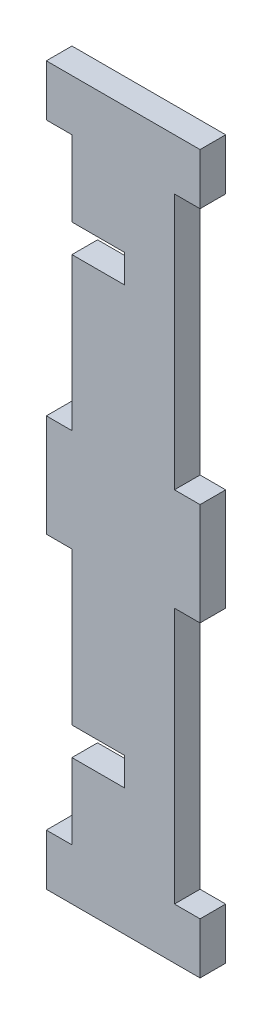
ISO-10303-21;
HEADER;
FILE_DESCRIPTION(('STEP AP214'),'2;1');
FILE_NAME('part.step','',(''),(''),'','','');
FILE_SCHEMA(('AUTOMOTIVE_DESIGN { 1 0 10303 214 1 1 1 1 }'));
ENDSEC;
DATA;
#1=APPLICATION_CONTEXT('core data for automotive mechanical design processes');
#2=APPLICATION_PROTOCOL_DEFINITION('international standard','automotive_design',2000,#1);
#3=PRODUCT_CONTEXT('',#1,'mechanical');
#4=PRODUCT('Part','Part','',(#3));
#5=PRODUCT_RELATED_PRODUCT_CATEGORY('part','',(#4));
#6=PRODUCT_DEFINITION_FORMATION('','',#4);
#7=PRODUCT_DEFINITION_CONTEXT('part definition',#1,'design');
#8=PRODUCT_DEFINITION('design','',#6,#7);
#9=PRODUCT_DEFINITION_SHAPE('','',#8);
#10=(LENGTH_UNIT() NAMED_UNIT(*) SI_UNIT(.MILLI.,.METRE.));
#11=(NAMED_UNIT(*) PLANE_ANGLE_UNIT() SI_UNIT($,.RADIAN.));
#12=(NAMED_UNIT(*) SI_UNIT($,.STERADIAN.) SOLID_ANGLE_UNIT());
#13=UNCERTAINTY_MEASURE_WITH_UNIT(LENGTH_MEASURE(1.E-05),#10,'distance_accuracy_value','');
#14=(GEOMETRIC_REPRESENTATION_CONTEXT(3) GLOBAL_UNCERTAINTY_ASSIGNED_CONTEXT((#13)) GLOBAL_UNIT_ASSIGNED_CONTEXT((#10,
#11,#12)) REPRESENTATION_CONTEXT('',''));
#15=CARTESIAN_POINT('',(0.,0.,0.));
#16=DIRECTION('',(0.,0.,1.));
#17=DIRECTION('',(1.,0.,0.));
#18=AXIS2_PLACEMENT_3D('',#15,#16,#17);
#19=CARTESIAN_POINT('',(-1086.45434164187,-202.296998666354,2.5));
#20=DIRECTION('',(-0.999999999999995,-1.02775432608838E-07,0.));
#21=DIRECTION('',(1.02775432608838E-07,-0.999999999999995,0.));
#22=AXIS2_PLACEMENT_3D('',#19,#20,#21);
#23=PLANE('',#22);
#24=DIRECTION('',(-1.02775432608838E-07,0.999999999999995,0.));
#25=VECTOR('',#24,1.);
#26=CARTESIAN_POINT('',(-1086.45434164187,-202.296998666354,-2.5));
#27=LINE('',#26,#25);
#28=CARTESIAN_POINT('',(-1086.45434061412,-212.296998666354,-2.5));
#29=VERTEX_POINT('',#28);
#30=CARTESIAN_POINT('',(-1086.45434164187,-202.296998666354,-2.5));
#31=VERTEX_POINT('',#30);
#32=EDGE_CURVE('E249',#29,#31,#27,.T.);
#33=ORIENTED_EDGE('',*,*,#32,.T.);
#34=DIRECTION('',(0.,0.,-1.));
#35=VECTOR('',#34,1.);
#36=CARTESIAN_POINT('',(-1086.45434164187,-202.296998666354,2.5));
#37=LINE('',#36,#35);
#38=CARTESIAN_POINT('',(-1086.45434164187,-202.296998666354,2.5));
#39=VERTEX_POINT('',#38);
#40=EDGE_CURVE('E11',#39,#31,#37,.T.);
#41=ORIENTED_EDGE('',*,*,#40,.F.);
#42=DIRECTION('',(-1.02775432608838E-07,0.999999999999995,0.));
#43=VECTOR('',#42,1.);
#44=CARTESIAN_POINT('',(-1086.45434164187,-202.296998666354,2.5));
#45=LINE('',#44,#43);
#46=CARTESIAN_POINT('',(-1086.45434061412,-212.296998666354,2.5));
#47=VERTEX_POINT('',#46);
#48=EDGE_CURVE('E303',#47,#39,#45,.T.);
#49=ORIENTED_EDGE('',*,*,#48,.F.);
#50=DIRECTION('',(0.,0.,-1.));
#51=VECTOR('',#50,1.);
#52=CARTESIAN_POINT('',(-1086.45434061412,-212.296998666354,2.5));
#53=LINE('',#52,#51);
#54=EDGE_CURVE('E245',#47,#29,#53,.T.);
#55=ORIENTED_EDGE('',*,*,#54,.T.);
#56=EDGE_LOOP('',(#33,#41,#49,#55));
#57=FACE_BOUND('',#56,.T.);
#58=ADVANCED_FACE('F33',(#57),#23,.F.);
#59=CARTESIAN_POINT('',(-1091.45434164187,-202.296999180231,2.5));
#60=DIRECTION('',(1.02775432608834E-07,-0.999999999999995,0.));
#61=DIRECTION('',(0.999999999999995,1.02775432608834E-07,0.));
#62=AXIS2_PLACEMENT_3D('',#59,#60,#61);
#63=PLANE('',#62);
#64=DIRECTION('',(-0.999999999999995,-1.02775432608834E-07,0.));
#65=VECTOR('',#64,1.);
#66=CARTESIAN_POINT('',(-1091.45434164187,-202.296999180231,-2.5));
#67=LINE('',#66,#65);
#68=CARTESIAN_POINT('',(-1091.45434164187,-202.296999180231,-2.5));
#69=VERTEX_POINT('',#68);
#70=EDGE_CURVE('E252',#31,#69,#67,.T.);
#71=ORIENTED_EDGE('',*,*,#70,.T.);
#72=DIRECTION('',(0.,0.,-1.));
#73=VECTOR('',#72,1.);
#74=CARTESIAN_POINT('',(-1091.45434164187,-202.296999180231,2.5));
#75=LINE('',#74,#73);
#76=CARTESIAN_POINT('',(-1091.45434164187,-202.296999180231,2.5));
#77=VERTEX_POINT('',#76);
#78=EDGE_CURVE('E41',#77,#69,#75,.T.);
#79=ORIENTED_EDGE('',*,*,#78,.F.);
#80=DIRECTION('',(-0.999999999999995,-1.02775432608834E-07,0.));
#81=VECTOR('',#80,1.);
#82=CARTESIAN_POINT('',(-1091.45434164187,-202.296999180231,2.5));
#83=LINE('',#82,#81);
#84=EDGE_CURVE('E152',#39,#77,#83,.T.);
#85=ORIENTED_EDGE('',*,*,#84,.F.);
#86=ORIENTED_EDGE('',*,*,#40,.T.);
#87=EDGE_LOOP('',(#71,#79,#85,#86));
#88=FACE_BOUND('',#87,.T.);
#89=ADVANCED_FACE('F461',(#88),#63,.F.);
#90=CARTESIAN_POINT('',(-1091.45434678064,-152.296999180231,2.5));
#91=DIRECTION('',(-0.999999999999995,-1.02775437049728E-07,0.));
#92=DIRECTION('',(1.02775437049728E-07,-0.999999999999995,0.));
#93=AXIS2_PLACEMENT_3D('',#90,#91,#92);
#94=PLANE('',#93);
#95=DIRECTION('',(-1.02775437049728E-07,0.999999999999995,0.));
#96=VECTOR('',#95,1.);
#97=CARTESIAN_POINT('',(-1091.45434678064,-152.296999180231,-2.5));
#98=LINE('',#97,#96);
#99=CARTESIAN_POINT('',(-1091.45434678064,-152.296999180231,-2.5));
#100=VERTEX_POINT('',#99);
#101=EDGE_CURVE('E254',#69,#100,#98,.T.);
#102=ORIENTED_EDGE('',*,*,#101,.T.);
#103=DIRECTION('',(0.,0.,-1.));
#104=VECTOR('',#103,1.);
#105=CARTESIAN_POINT('',(-1091.45434678064,-152.296999180231,2.5));
#106=LINE('',#105,#104);
#107=CARTESIAN_POINT('',(-1091.45434678064,-152.296999180231,2.5));
#108=VERTEX_POINT('',#107);
#109=EDGE_CURVE('E370',#108,#100,#106,.T.);
#110=ORIENTED_EDGE('',*,*,#109,.F.);
#111=DIRECTION('',(-1.02775437049728E-07,0.999999999999995,0.));
#112=VECTOR('',#111,1.);
#113=CARTESIAN_POINT('',(-1091.45434678064,-152.296999180231,2.5));
#114=LINE('',#113,#112);
#115=EDGE_CURVE('E378',#77,#108,#114,.T.);
#116=ORIENTED_EDGE('',*,*,#115,.F.);
#117=ORIENTED_EDGE('',*,*,#78,.T.);
#118=EDGE_LOOP('',(#102,#110,#116,#117));
#119=FACE_BOUND('',#118,.T.);
#120=ADVANCED_FACE('F376',(#119),#94,.F.);
#121=CARTESIAN_POINT('',(-1086.45434678064,-152.296998666354,2.5));
#122=DIRECTION('',(-1.02775438159972E-07,0.999999999999995,0.));
#123=DIRECTION('',(-0.999999999999995,-1.02775438159972E-07,0.));
#124=AXIS2_PLACEMENT_3D('',#121,#122,#123);
#125=PLANE('',#124);
#126=DIRECTION('',(0.999999999999995,1.02775438159972E-07,0.));
#127=VECTOR('',#126,1.);
#128=CARTESIAN_POINT('',(-1086.45434678064,-152.296998666354,-2.5));
#129=LINE('',#128,#127);
#130=CARTESIAN_POINT('',(-1086.45434678064,-152.296998666354,-2.5));
#131=VERTEX_POINT('',#130);
#132=EDGE_CURVE('E256',#100,#131,#129,.T.);
#133=ORIENTED_EDGE('',*,*,#132,.T.);
#134=DIRECTION('',(0.,0.,-1.));
#135=VECTOR('',#134,1.);
#136=CARTESIAN_POINT('',(-1086.45434678064,-152.296998666354,2.5));
#137=LINE('',#136,#135);
#138=CARTESIAN_POINT('',(-1086.45434678064,-152.296998666354,2.5));
#139=VERTEX_POINT('',#138);
#140=EDGE_CURVE('E367',#139,#131,#137,.T.);
#141=ORIENTED_EDGE('',*,*,#140,.F.);
#142=DIRECTION('',(0.999999999999995,1.02775438159972E-07,0.));
#143=VECTOR('',#142,1.);
#144=CARTESIAN_POINT('',(-1086.45434678064,-152.296998666354,2.5));
#145=LINE('',#144,#143);
#146=EDGE_CURVE('E396',#108,#139,#145,.T.);
#147=ORIENTED_EDGE('',*,*,#146,.F.);
#148=ORIENTED_EDGE('',*,*,#109,.T.);
#149=EDGE_LOOP('',(#133,#141,#147,#148));
#150=FACE_BOUND('',#149,.T.);
#151=ADVANCED_FACE('F387',(#150),#125,.F.);
#152=CARTESIAN_POINT('',(-1086.45434883615,-132.296993578953,2.5));
#153=DIRECTION('',(-0.999999999999995,-1.02775495283673E-07,0.));
#154=DIRECTION('',(1.02775495283673E-07,-0.999999999999995,0.));
#155=AXIS2_PLACEMENT_3D('',#152,#153,#154);
#156=PLANE('',#155);
#157=DIRECTION('',(-1.02775495283673E-07,0.999999999999995,0.));
#158=VECTOR('',#157,1.);
#159=CARTESIAN_POINT('',(-1086.45434883615,-132.296993578953,-2.5));
#160=LINE('',#159,#158);
#161=CARTESIAN_POINT('',(-1086.45434883615,-132.296993578953,-2.5));
#162=VERTEX_POINT('',#161);
#163=EDGE_CURVE('E258',#131,#162,#160,.T.);
#164=ORIENTED_EDGE('',*,*,#163,.T.);
#165=DIRECTION('',(0.,0.,-1.));
#166=VECTOR('',#165,1.);
#167=CARTESIAN_POINT('',(-1086.45434883615,-132.296993578953,2.5));
#168=LINE('',#167,#166);
#169=CARTESIAN_POINT('',(-1086.45434883615,-132.296993578953,2.5));
#170=VERTEX_POINT('',#169);
#171=EDGE_CURVE('E364',#170,#162,#168,.T.);
#172=ORIENTED_EDGE('',*,*,#171,.F.);
#173=DIRECTION('',(-1.02775495283673E-07,0.999999999999995,0.));
#174=VECTOR('',#173,1.);
#175=CARTESIAN_POINT('',(-1086.45434883615,-132.296993578953,2.5));
#176=LINE('',#175,#174);
#177=EDGE_CURVE('E393',#139,#170,#176,.T.);
#178=ORIENTED_EDGE('',*,*,#177,.F.);
#179=ORIENTED_EDGE('',*,*,#140,.T.);
#180=EDGE_LOOP('',(#164,#172,#178,#179));
#181=FACE_BOUND('',#180,.T.);
#182=ADVANCED_FACE('F391',(#181),#156,.F.);
#183=CARTESIAN_POINT('',(-1086.45434883615,-132.296993578953,2.5));
#184=DIRECTION('',(1.02775504773358E-07,-0.999999999999995,0.));
#185=DIRECTION('',(0.999999999999995,1.02775504773358E-07,0.));
#186=AXIS2_PLACEMENT_3D('',#183,#184,#185);
#187=PLANE('',#186);
#188=DIRECTION('',(-0.999999999999995,-1.02775504773358E-07,0.));
#189=VECTOR('',#188,1.);
#190=CARTESIAN_POINT('',(-1086.45434883615,-132.296993578953,-2.5));
#191=LINE('',#190,#189);
#192=CARTESIAN_POINT('',(-1091.45434883615,-132.296994092831,-2.5));
#193=VERTEX_POINT('',#192);
#194=EDGE_CURVE('E260',#162,#193,#191,.T.);
#195=ORIENTED_EDGE('',*,*,#194,.T.);
#196=DIRECTION('',(0.,0.,-1.));
#197=VECTOR('',#196,1.);
#198=CARTESIAN_POINT('',(-1091.45434883615,-132.296994092831,2.5));
#199=LINE('',#198,#197);
#200=CARTESIAN_POINT('',(-1091.45434883615,-132.296994092831,2.5));
#201=VERTEX_POINT('',#200);
#202=EDGE_CURVE('E361',#201,#193,#199,.T.);
#203=ORIENTED_EDGE('',*,*,#202,.F.);
#204=DIRECTION('',(-0.999999999999995,-1.02775504773358E-07,0.));
#205=VECTOR('',#204,1.);
#206=CARTESIAN_POINT('',(-1086.45434883615,-132.296993578953,2.5));
#207=LINE('',#206,#205);
#208=EDGE_CURVE('E395',#170,#201,#207,.T.);
#209=ORIENTED_EDGE('',*,*,#208,.F.);
#210=ORIENTED_EDGE('',*,*,#171,.T.);
#211=EDGE_LOOP('',(#195,#203,#209,#210));
#212=FACE_BOUND('',#211,.T.);
#213=ADVANCED_FACE('F474',(#212),#187,.F.);
#214=CARTESIAN_POINT('',(-1091.45434883615,-132.296994092831,2.5));
#215=DIRECTION('',(-0.999999999999995,-1.0277546369508E-07,0.));
#216=DIRECTION('',(1.0277546369508E-07,-0.999999999999995,0.));
#217=AXIS2_PLACEMENT_3D('',#214,#215,#216);
#218=PLANE('',#217);
#219=DIRECTION('',(-1.0277546369508E-07,0.999999999999995,0.));
#220=VECTOR('',#219,1.);
#221=CARTESIAN_POINT('',(-1091.45434883615,-132.296994092831,-2.5));
#222=LINE('',#221,#220);
#223=CARTESIAN_POINT('',(-1091.45435397492,-82.2969940928305,-2.5));
#224=VERTEX_POINT('',#223);
#225=EDGE_CURVE('E262',#193,#224,#222,.T.);
#226=ORIENTED_EDGE('',*,*,#225,.T.);
#227=DIRECTION('',(0.,0.,-1.));
#228=VECTOR('',#227,1.);
#229=CARTESIAN_POINT('',(-1091.45435397492,-82.2969940928305,2.5));
#230=LINE('',#229,#228);
#231=CARTESIAN_POINT('',(-1091.45435397492,-82.2969940928305,2.5));
#232=VERTEX_POINT('',#231);
#233=EDGE_CURVE('E358',#232,#224,#230,.T.);
#234=ORIENTED_EDGE('',*,*,#233,.F.);
#235=DIRECTION('',(-1.0277546369508E-07,0.999999999999995,0.));
#236=VECTOR('',#235,1.);
#237=CARTESIAN_POINT('',(-1091.45434883615,-132.296994092831,2.5));
#238=LINE('',#237,#236);
#239=EDGE_CURVE('E398',#201,#232,#238,.T.);
#240=ORIENTED_EDGE('',*,*,#239,.F.);
#241=ORIENTED_EDGE('',*,*,#202,.T.);
#242=EDGE_LOOP('',(#226,#234,#240,#241));
#243=FACE_BOUND('',#242,.T.);
#244=ADVANCED_FACE('F477',(#243),#218,.F.);
#245=CARTESIAN_POINT('',(-1091.45435397492,-82.2969940928305,2.5));
#246=DIRECTION('',(-1.02775435384387E-07,0.999999999999995,0.));
#247=DIRECTION('',(-0.999999999999995,-1.02775435384387E-07,0.));
#248=AXIS2_PLACEMENT_3D('',#245,#246,#247);
#249=PLANE('',#248);
#250=DIRECTION('',(0.999999999999995,1.02775435384387E-07,0.));
#251=VECTOR('',#250,1.);
#252=CARTESIAN_POINT('',(-1091.45435397492,-82.2969940928305,-2.5));
#253=LINE('',#252,#251);
#254=CARTESIAN_POINT('',(-1086.45435397492,-82.2969935789533,-2.5));
#255=VERTEX_POINT('',#254);
#256=EDGE_CURVE('E264',#224,#255,#253,.T.);
#257=ORIENTED_EDGE('',*,*,#256,.T.);
#258=DIRECTION('',(0.,0.,-1.));
#259=VECTOR('',#258,1.);
#260=CARTESIAN_POINT('',(-1086.45435397492,-82.2969935789533,2.5));
#261=LINE('',#260,#259);
#262=CARTESIAN_POINT('',(-1086.45435397492,-82.2969935789533,2.5));
#263=VERTEX_POINT('',#262);
#264=EDGE_CURVE('E355',#263,#255,#261,.T.);
#265=ORIENTED_EDGE('',*,*,#264,.F.);
#266=DIRECTION('',(0.999999999999995,1.02775435384387E-07,0.));
#267=VECTOR('',#266,1.);
#268=CARTESIAN_POINT('',(-1091.45435397492,-82.2969940928305,2.5));
#269=LINE('',#268,#267);
#270=EDGE_CURVE('E404',#232,#263,#269,.T.);
#271=ORIENTED_EDGE('',*,*,#270,.F.);
#272=ORIENTED_EDGE('',*,*,#233,.T.);
#273=EDGE_LOOP('',(#257,#265,#271,#272));
#274=FACE_BOUND('',#273,.T.);
#275=ADVANCED_FACE('F481',(#274),#249,.F.);
#276=CARTESIAN_POINT('',(-1086.45435397492,-82.2969935789533,2.5));
#277=DIRECTION('',(-0.999999999999995,-1.02775454813298E-07,0.));
#278=DIRECTION('',(1.02775454813298E-07,-0.999999999999995,0.));
#279=AXIS2_PLACEMENT_3D('',#276,#277,#278);
#280=PLANE('',#279);
#281=DIRECTION('',(-1.02775454813298E-07,0.999999999999995,0.));
#282=VECTOR('',#281,1.);
#283=CARTESIAN_POINT('',(-1086.45435397492,-82.2969935789533,-2.5));
#284=LINE('',#283,#282);
#285=CARTESIAN_POINT('',(-1086.45435500268,-72.2969935789534,-2.5));
#286=VERTEX_POINT('',#285);
#287=EDGE_CURVE('E266',#255,#286,#284,.T.);
#288=ORIENTED_EDGE('',*,*,#287,.T.);
#289=DIRECTION('',(0.,0.,-1.));
#290=VECTOR('',#289,1.);
#291=CARTESIAN_POINT('',(-1086.45435500268,-72.2969935789534,2.5));
#292=LINE('',#291,#290);
#293=CARTESIAN_POINT('',(-1086.45435500268,-72.2969935789534,2.5));
#294=VERTEX_POINT('',#293);
#295=EDGE_CURVE('E352',#294,#286,#292,.T.);
#296=ORIENTED_EDGE('',*,*,#295,.F.);
#297=DIRECTION('',(-1.02775454813298E-07,0.999999999999995,0.));
#298=VECTOR('',#297,1.);
#299=CARTESIAN_POINT('',(-1086.45435397492,-82.2969935789533,2.5));
#300=LINE('',#299,#298);
#301=EDGE_CURVE('E406',#263,#294,#300,.T.);
#302=ORIENTED_EDGE('',*,*,#301,.F.);
#303=ORIENTED_EDGE('',*,*,#264,.T.);
#304=EDGE_LOOP('',(#288,#296,#302,#303));
#305=FACE_BOUND('',#304,.T.);
#306=ADVANCED_FACE('F485',(#305),#280,.F.);
#307=CARTESIAN_POINT('',(-1086.45435500268,-72.2969935789534,2.5));
#308=DIRECTION('',(1.02775447874407E-07,-0.999999999999995,0.));
#309=DIRECTION('',(0.999999999999995,1.02775447874407E-07,0.));
#310=AXIS2_PLACEMENT_3D('',#307,#308,#309);
#311=PLANE('',#310);
#312=DIRECTION('',(-0.999999999999995,-1.02775447874407E-07,0.));
#313=VECTOR('',#312,1.);
#314=CARTESIAN_POINT('',(-1086.45435500268,-72.2969935789534,-2.5));
#315=LINE('',#314,#313);
#316=CARTESIAN_POINT('',(-1116.45435500268,-72.2969966622168,-2.5));
#317=VERTEX_POINT('',#316);
#318=EDGE_CURVE('E268',#286,#317,#315,.T.);
#319=ORIENTED_EDGE('',*,*,#318,.T.);
#320=DIRECTION('',(0.,0.,-1.));
#321=VECTOR('',#320,1.);
#322=CARTESIAN_POINT('',(-1116.45435500268,-72.2969966622168,2.5));
#323=LINE('',#322,#321);
#324=CARTESIAN_POINT('',(-1116.45435500268,-72.2969966622168,2.5));
#325=VERTEX_POINT('',#324);
#326=EDGE_CURVE('E349',#325,#317,#323,.T.);
#327=ORIENTED_EDGE('',*,*,#326,.F.);
#328=DIRECTION('',(-0.999999999999995,-1.02775447874407E-07,0.));
#329=VECTOR('',#328,1.);
#330=CARTESIAN_POINT('',(-1086.45435500268,-72.2969935789534,2.5));
#331=LINE('',#330,#329);
#332=EDGE_CURVE('E408',#294,#325,#331,.T.);
#333=ORIENTED_EDGE('',*,*,#332,.F.);
#334=ORIENTED_EDGE('',*,*,#295,.T.);
#335=EDGE_LOOP('',(#319,#327,#333,#334));
#336=FACE_BOUND('',#335,.T.);
#337=ADVANCED_FACE('F489',(#336),#311,.F.);
#338=CARTESIAN_POINT('',(-1116.45435500268,-72.2969966622168,2.5));
#339=DIRECTION('',(0.999999999999995,1.02775454813298E-07,0.));
#340=DIRECTION('',(-1.02775454813298E-07,0.999999999999995,0.));
#341=AXIS2_PLACEMENT_3D('',#338,#339,#340);
#342=PLANE('',#341);
#343=DIRECTION('',(1.02775454813298E-07,-0.999999999999995,0.));
#344=VECTOR('',#343,1.);
#345=CARTESIAN_POINT('',(-1116.45435500268,-72.2969966622168,-2.5));
#346=LINE('',#345,#344);
#347=CARTESIAN_POINT('',(-1116.45435397492,-82.2969966622167,-2.5));
#348=VERTEX_POINT('',#347);
#349=EDGE_CURVE('E270',#317,#348,#346,.T.);
#350=ORIENTED_EDGE('',*,*,#349,.T.);
#351=DIRECTION('',(0.,0.,-1.));
#352=VECTOR('',#351,1.);
#353=CARTESIAN_POINT('',(-1116.45435397492,-82.2969966622167,2.5));
#354=LINE('',#353,#352);
#355=CARTESIAN_POINT('',(-1116.45435397492,-82.2969966622167,2.5));
#356=VERTEX_POINT('',#355);
#357=EDGE_CURVE('E346',#356,#348,#354,.T.);
#358=ORIENTED_EDGE('',*,*,#357,.F.);
#359=DIRECTION('',(1.02775454813298E-07,-0.999999999999995,0.));
#360=VECTOR('',#359,1.);
#361=CARTESIAN_POINT('',(-1116.45435500268,-72.2969966622168,2.5));
#362=LINE('',#361,#360);
#363=EDGE_CURVE('E410',#325,#356,#362,.T.);
#364=ORIENTED_EDGE('',*,*,#363,.F.);
#365=ORIENTED_EDGE('',*,*,#326,.T.);
#366=EDGE_LOOP('',(#350,#358,#364,#365));
#367=FACE_BOUND('',#366,.T.);
#368=ADVANCED_FACE('F493',(#367),#342,.F.);
#369=CARTESIAN_POINT('',(-1116.45435397492,-82.2969966622167,2.5));
#370=DIRECTION('',(-1.02775435384419E-07,0.999999999999995,0.));
#371=DIRECTION('',(-0.999999999999995,-1.02775435384419E-07,0.));
#372=AXIS2_PLACEMENT_3D('',#369,#370,#371);
#373=PLANE('',#372);
#374=DIRECTION('',(0.999999999999995,1.02775435384419E-07,0.));
#375=VECTOR('',#374,1.);
#376=CARTESIAN_POINT('',(-1116.45435397492,-82.2969966622167,-2.5));
#377=LINE('',#376,#375);
#378=CARTESIAN_POINT('',(-1111.45435397492,-82.2969961483395,-2.5));
#379=VERTEX_POINT('',#378);
#380=EDGE_CURVE('E272',#348,#379,#377,.T.);
#381=ORIENTED_EDGE('',*,*,#380,.T.);
#382=DIRECTION('',(0.,0.,-1.));
#383=VECTOR('',#382,1.);
#384=CARTESIAN_POINT('',(-1111.45435397492,-82.2969961483395,2.5));
#385=LINE('',#384,#383);
#386=CARTESIAN_POINT('',(-1111.45435397492,-82.2969961483395,2.5));
#387=VERTEX_POINT('',#386);
#388=EDGE_CURVE('E343',#387,#379,#385,.T.);
#389=ORIENTED_EDGE('',*,*,#388,.F.);
#390=DIRECTION('',(0.999999999999995,1.02775435384419E-07,0.));
#391=VECTOR('',#390,1.);
#392=CARTESIAN_POINT('',(-1116.45435397492,-82.2969966622167,2.5));
#393=LINE('',#392,#391);
#394=EDGE_CURVE('E412',#356,#387,#393,.T.);
#395=ORIENTED_EDGE('',*,*,#394,.F.);
#396=ORIENTED_EDGE('',*,*,#357,.T.);
#397=EDGE_LOOP('',(#381,#389,#395,#396));
#398=FACE_BOUND('',#397,.T.);
#399=ADVANCED_FACE('F497',(#398),#373,.F.);
#400=CARTESIAN_POINT('',(-1111.45435397492,-82.2969961483395,2.5));
#401=DIRECTION('',(0.999999999999995,1.02775460458495E-07,0.));
#402=DIRECTION('',(-1.02775460458495E-07,0.999999999999995,0.));
#403=AXIS2_PLACEMENT_3D('',#400,#401,#402);
#404=PLANE('',#403);
#405=DIRECTION('',(1.02775460458495E-07,-0.999999999999995,0.));
#406=VECTOR('',#405,1.);
#407=CARTESIAN_POINT('',(-1111.45435397492,-82.2969961483395,-2.5));
#408=LINE('',#407,#406);
#409=CARTESIAN_POINT('',(-1111.45435245899,-97.0469961483401,-2.5));
#410=VERTEX_POINT('',#409);
#411=EDGE_CURVE('E274',#379,#410,#408,.T.);
#412=ORIENTED_EDGE('',*,*,#411,.T.);
#413=DIRECTION('',(0.,0.,-1.));
#414=VECTOR('',#413,1.);
#415=CARTESIAN_POINT('',(-1111.45435245899,-97.0469961483401,2.5));
#416=LINE('',#415,#414);
#417=CARTESIAN_POINT('',(-1111.45435245899,-97.0469961483401,2.5));
#418=VERTEX_POINT('',#417);
#419=EDGE_CURVE('E340',#418,#410,#416,.T.);
#420=ORIENTED_EDGE('',*,*,#419,.F.);
#421=DIRECTION('',(1.02775460458495E-07,-0.999999999999995,0.));
#422=VECTOR('',#421,1.);
#423=CARTESIAN_POINT('',(-1111.45435397492,-82.2969961483395,2.5));
#424=LINE('',#423,#422);
#425=EDGE_CURVE('E414',#387,#418,#424,.T.);
#426=ORIENTED_EDGE('',*,*,#425,.F.);
#427=ORIENTED_EDGE('',*,*,#388,.T.);
#428=EDGE_LOOP('',(#412,#420,#426,#427));
#429=FACE_BOUND('',#428,.T.);
#430=ADVANCED_FACE('F501',(#429),#404,.F.);
#431=CARTESIAN_POINT('',(-1101.20435245899,-97.0469950948916,2.5));
#432=DIRECTION('',(-1.02775465644736E-07,0.999999999999995,0.));
#433=DIRECTION('',(-0.999999999999995,-1.02775465644736E-07,0.));
#434=AXIS2_PLACEMENT_3D('',#431,#432,#433);
#435=PLANE('',#434);
#436=DIRECTION('',(0.999999999999995,1.02775465644736E-07,0.));
#437=VECTOR('',#436,1.);
#438=CARTESIAN_POINT('',(-1101.20435245899,-97.0469950948916,-2.5));
#439=LINE('',#438,#437);
#440=CARTESIAN_POINT('',(-1101.20435245899,-97.0469950948916,-2.5));
#441=VERTEX_POINT('',#440);
#442=EDGE_CURVE('E276',#410,#441,#439,.T.);
#443=ORIENTED_EDGE('',*,*,#442,.T.);
#444=DIRECTION('',(0.,0.,-1.));
#445=VECTOR('',#444,1.);
#446=CARTESIAN_POINT('',(-1101.20435245899,-97.0469950948916,2.5));
#447=LINE('',#446,#445);
#448=CARTESIAN_POINT('',(-1101.20435245899,-97.0469950948916,2.5));
#449=VERTEX_POINT('',#448);
#450=EDGE_CURVE('E337',#449,#441,#447,.T.);
#451=ORIENTED_EDGE('',*,*,#450,.F.);
#452=DIRECTION('',(0.999999999999995,1.02775465644736E-07,0.));
#453=VECTOR('',#452,1.);
#454=CARTESIAN_POINT('',(-1101.20435245899,-97.0469950948916,2.5));
#455=LINE('',#454,#453);
#456=EDGE_CURVE('E416',#418,#449,#455,.T.);
#457=ORIENTED_EDGE('',*,*,#456,.F.);
#458=ORIENTED_EDGE('',*,*,#419,.T.);
#459=EDGE_LOOP('',(#443,#451,#457,#458));
#460=FACE_BOUND('',#459,.T.);
#461=ADVANCED_FACE('F505',(#460),#435,.F.);
#462=CARTESIAN_POINT('',(-1101.20435189372,-102.546995094891,2.5));
#463=DIRECTION('',(0.999999999999995,1.02775444720364E-07,0.));
#464=DIRECTION('',(-1.02775444720364E-07,0.999999999999995,0.));
#465=AXIS2_PLACEMENT_3D('',#462,#463,#464);
#466=PLANE('',#465);
#467=DIRECTION('',(1.02775444720364E-07,-0.999999999999995,0.));
#468=VECTOR('',#467,1.);
#469=CARTESIAN_POINT('',(-1101.20435189372,-102.546995094891,-2.5));
#470=LINE('',#469,#468);
#471=CARTESIAN_POINT('',(-1101.20435189372,-102.546995094891,-2.5));
#472=VERTEX_POINT('',#471);
#473=EDGE_CURVE('E278',#441,#472,#470,.T.);
#474=ORIENTED_EDGE('',*,*,#473,.T.);
#475=DIRECTION('',(0.,0.,-1.));
#476=VECTOR('',#475,1.);
#477=CARTESIAN_POINT('',(-1101.20435189372,-102.546995094891,2.5));
#478=LINE('',#477,#476);
#479=CARTESIAN_POINT('',(-1101.20435189372,-102.546995094891,2.5));
#480=VERTEX_POINT('',#479);
#481=EDGE_CURVE('E334',#480,#472,#478,.T.);
#482=ORIENTED_EDGE('',*,*,#481,.F.);
#483=DIRECTION('',(1.02775444720364E-07,-0.999999999999995,0.));
#484=VECTOR('',#483,1.);
#485=CARTESIAN_POINT('',(-1101.20435189372,-102.546995094891,2.5));
#486=LINE('',#485,#484);
#487=EDGE_CURVE('E418',#449,#480,#486,.T.);
#488=ORIENTED_EDGE('',*,*,#487,.F.);
#489=ORIENTED_EDGE('',*,*,#450,.T.);
#490=EDGE_LOOP('',(#474,#482,#488,#489));
#491=FACE_BOUND('',#490,.T.);
#492=ADVANCED_FACE('F509',(#491),#466,.F.);
#493=CARTESIAN_POINT('',(-1111.45435189372,-102.54699614834,2.5));
#494=DIRECTION('',(1.02775468352595E-07,-0.999999999999995,0.));
#495=DIRECTION('',(0.999999999999995,1.02775468352595E-07,0.));
#496=AXIS2_PLACEMENT_3D('',#493,#494,#495);
#497=PLANE('',#496);
#498=DIRECTION('',(-0.999999999999995,-1.02775468352595E-07,0.));
#499=VECTOR('',#498,1.);
#500=CARTESIAN_POINT('',(-1111.45435189372,-102.54699614834,-2.5));
#501=LINE('',#500,#499);
#502=CARTESIAN_POINT('',(-1111.45435189372,-102.54699614834,-2.5));
#503=VERTEX_POINT('',#502);
#504=EDGE_CURVE('E280',#472,#503,#501,.T.);
#505=ORIENTED_EDGE('',*,*,#504,.T.);
#506=DIRECTION('',(0.,0.,-1.));
#507=VECTOR('',#506,1.);
#508=CARTESIAN_POINT('',(-1111.45435189372,-102.54699614834,2.5));
#509=LINE('',#508,#507);
#510=CARTESIAN_POINT('',(-1111.45435189372,-102.54699614834,2.5));
#511=VERTEX_POINT('',#510);
#512=EDGE_CURVE('E331',#511,#503,#509,.T.);
#513=ORIENTED_EDGE('',*,*,#512,.F.);
#514=DIRECTION('',(-0.999999999999995,-1.02775468352595E-07,0.));
#515=VECTOR('',#514,1.);
#516=CARTESIAN_POINT('',(-1111.45435189372,-102.54699614834,2.5));
#517=LINE('',#516,#515);
#518=EDGE_CURVE('E420',#480,#511,#517,.T.);
#519=ORIENTED_EDGE('',*,*,#518,.F.);
#520=ORIENTED_EDGE('',*,*,#481,.T.);
#521=EDGE_LOOP('',(#505,#513,#519,#520));
#522=FACE_BOUND('',#521,.T.);
#523=ADVANCED_FACE('F513',(#522),#497,.F.);
#524=CARTESIAN_POINT('',(-1111.45435189372,-102.54699614834,2.5));
#525=DIRECTION('',(0.999999999999995,1.02775431489285E-07,0.));
#526=DIRECTION('',(-1.02775431489285E-07,0.999999999999995,0.));
#527=AXIS2_PLACEMENT_3D('',#524,#525,#526);
#528=PLANE('',#527);
#529=DIRECTION('',(1.02775431489285E-07,-0.999999999999995,0.));
#530=VECTOR('',#529,1.);
#531=CARTESIAN_POINT('',(-1111.45435189372,-102.54699614834,-2.5));
#532=LINE('',#531,#530);
#533=CARTESIAN_POINT('',(-1111.45434883615,-132.29699614834,-2.5));
#534=VERTEX_POINT('',#533);
#535=EDGE_CURVE('E282',#503,#534,#532,.T.);
#536=ORIENTED_EDGE('',*,*,#535,.T.);
#537=DIRECTION('',(0.,0.,-1.));
#538=VECTOR('',#537,1.);
#539=CARTESIAN_POINT('',(-1111.45434883615,-132.29699614834,2.5));
#540=LINE('',#539,#538);
#541=CARTESIAN_POINT('',(-1111.45434883615,-132.29699614834,2.5));
#542=VERTEX_POINT('',#541);
#543=EDGE_CURVE('E328',#542,#534,#540,.T.);
#544=ORIENTED_EDGE('',*,*,#543,.F.);
#545=DIRECTION('',(1.02775431489285E-07,-0.999999999999995,0.));
#546=VECTOR('',#545,1.);
#547=CARTESIAN_POINT('',(-1111.45435189372,-102.54699614834,2.5));
#548=LINE('',#547,#546);
#549=EDGE_CURVE('E422',#511,#542,#548,.T.);
#550=ORIENTED_EDGE('',*,*,#549,.F.);
#551=ORIENTED_EDGE('',*,*,#512,.T.);
#552=EDGE_LOOP('',(#536,#544,#550,#551));
#553=FACE_BOUND('',#552,.T.);
#554=ADVANCED_FACE('F517',(#553),#528,.F.);
#555=CARTESIAN_POINT('',(-1111.45434883615,-132.29699614834,2.5));
#556=DIRECTION('',(1.02775438159972E-07,-0.999999999999995,0.));
#557=DIRECTION('',(0.999999999999995,1.02775438159972E-07,0.));
#558=AXIS2_PLACEMENT_3D('',#555,#556,#557);
#559=PLANE('',#558);
#560=DIRECTION('',(-0.999999999999995,-1.02775438159972E-07,0.));
#561=VECTOR('',#560,1.);
#562=CARTESIAN_POINT('',(-1111.45434883615,-132.29699614834,-2.5));
#563=LINE('',#562,#561);
#564=CARTESIAN_POINT('',(-1116.45434883615,-132.296996662217,-2.5));
#565=VERTEX_POINT('',#564);
#566=EDGE_CURVE('E284',#534,#565,#563,.T.);
#567=ORIENTED_EDGE('',*,*,#566,.T.);
#568=DIRECTION('',(0.,0.,-1.));
#569=VECTOR('',#568,1.);
#570=CARTESIAN_POINT('',(-1116.45434883615,-132.296996662217,2.5));
#571=LINE('',#570,#569);
#572=CARTESIAN_POINT('',(-1116.45434883615,-132.296996662217,2.5));
#573=VERTEX_POINT('',#572);
#574=EDGE_CURVE('E325',#573,#565,#571,.T.);
#575=ORIENTED_EDGE('',*,*,#574,.F.);
#576=DIRECTION('',(-0.999999999999995,-1.02775438159972E-07,0.));
#577=VECTOR('',#576,1.);
#578=CARTESIAN_POINT('',(-1111.45434883615,-132.29699614834,2.5));
#579=LINE('',#578,#577);
#580=EDGE_CURVE('E424',#542,#573,#579,.T.);
#581=ORIENTED_EDGE('',*,*,#580,.F.);
#582=ORIENTED_EDGE('',*,*,#543,.T.);
#583=EDGE_LOOP('',(#567,#575,#581,#582));
#584=FACE_BOUND('',#583,.T.);
#585=ADVANCED_FACE('F521',(#584),#559,.F.);
#586=CARTESIAN_POINT('',(-1116.45434883615,-132.296996662217,2.5));
#587=DIRECTION('',(0.999999999999995,1.02775484181446E-07,0.));
#588=DIRECTION('',(-1.02775484181446E-07,0.999999999999995,0.));
#589=AXIS2_PLACEMENT_3D('',#586,#587,#588);
#590=PLANE('',#589);
#591=DIRECTION('',(1.02775484181446E-07,-0.999999999999995,0.));
#592=VECTOR('',#591,1.);
#593=CARTESIAN_POINT('',(-1116.45434883615,-132.296996662217,-2.5));
#594=LINE('',#593,#592);
#595=CARTESIAN_POINT('',(-1116.45434678064,-152.297001749617,-2.5));
#596=VERTEX_POINT('',#595);
#597=EDGE_CURVE('E286',#565,#596,#594,.T.);
#598=ORIENTED_EDGE('',*,*,#597,.T.);
#599=DIRECTION('',(0.,0.,-1.));
#600=VECTOR('',#599,1.);
#601=CARTESIAN_POINT('',(-1116.45434678064,-152.297001749617,2.5));
#602=LINE('',#601,#600);
#603=CARTESIAN_POINT('',(-1116.45434678064,-152.297001749617,2.5));
#604=VERTEX_POINT('',#603);
#605=EDGE_CURVE('E322',#604,#596,#602,.T.);
#606=ORIENTED_EDGE('',*,*,#605,.F.);
#607=DIRECTION('',(1.02775484181446E-07,-0.999999999999995,0.));
#608=VECTOR('',#607,1.);
#609=CARTESIAN_POINT('',(-1116.45434883615,-132.296996662217,2.5));
#610=LINE('',#609,#608);
#611=EDGE_CURVE('E426',#573,#604,#610,.T.);
#612=ORIENTED_EDGE('',*,*,#611,.F.);
#613=ORIENTED_EDGE('',*,*,#574,.T.);
#614=EDGE_LOOP('',(#598,#606,#612,#613));
#615=FACE_BOUND('',#614,.T.);
#616=ADVANCED_FACE('F525',(#615),#590,.F.);
#617=CARTESIAN_POINT('',(-1111.45434678064,-152.29700123574,2.5));
#618=DIRECTION('',(-1.02775438159977E-07,0.999999999999995,0.));
#619=DIRECTION('',(-0.999999999999995,-1.02775438159977E-07,0.));
#620=AXIS2_PLACEMENT_3D('',#617,#618,#619);
#621=PLANE('',#620);
#622=DIRECTION('',(0.999999999999995,1.02775438159977E-07,0.));
#623=VECTOR('',#622,1.);
#624=CARTESIAN_POINT('',(-1111.45434678064,-152.29700123574,-2.5));
#625=LINE('',#624,#623);
#626=CARTESIAN_POINT('',(-1111.45434678064,-152.29700123574,-2.5));
#627=VERTEX_POINT('',#626);
#628=EDGE_CURVE('E288',#596,#627,#625,.T.);
#629=ORIENTED_EDGE('',*,*,#628,.T.);
#630=DIRECTION('',(0.,0.,-1.));
#631=VECTOR('',#630,1.);
#632=CARTESIAN_POINT('',(-1111.45434678064,-152.29700123574,2.5));
#633=LINE('',#632,#631);
#634=CARTESIAN_POINT('',(-1111.45434678064,-152.29700123574,2.5));
#635=VERTEX_POINT('',#634);
#636=EDGE_CURVE('E319',#635,#627,#633,.T.);
#637=ORIENTED_EDGE('',*,*,#636,.F.);
#638=DIRECTION('',(0.999999999999995,1.02775438159977E-07,0.));
#639=VECTOR('',#638,1.);
#640=CARTESIAN_POINT('',(-1111.45434678064,-152.29700123574,2.5));
#641=LINE('',#640,#639);
#642=EDGE_CURVE('E428',#604,#635,#641,.T.);
#643=ORIENTED_EDGE('',*,*,#642,.F.);
#644=ORIENTED_EDGE('',*,*,#605,.T.);
#645=EDGE_LOOP('',(#629,#637,#643,#644));
#646=FACE_BOUND('',#645,.T.);
#647=ADVANCED_FACE('F529',(#646),#621,.F.);
#648=CARTESIAN_POINT('',(-1111.45434372307,-182.04700123574,2.5));
#649=DIRECTION('',(0.999999999999995,1.02775468807705E-07,0.));
#650=DIRECTION('',(-1.02775468807705E-07,0.999999999999995,0.));
#651=AXIS2_PLACEMENT_3D('',#648,#649,#650);
#652=PLANE('',#651);
#653=DIRECTION('',(1.02775468807705E-07,-0.999999999999995,0.));
#654=VECTOR('',#653,1.);
#655=CARTESIAN_POINT('',(-1111.45434372307,-182.04700123574,-2.5));
#656=LINE('',#655,#654);
#657=CARTESIAN_POINT('',(-1111.45434372307,-182.04700123574,-2.5));
#658=VERTEX_POINT('',#657);
#659=EDGE_CURVE('E290',#627,#658,#656,.T.);
#660=ORIENTED_EDGE('',*,*,#659,.T.);
#661=DIRECTION('',(0.,0.,-1.));
#662=VECTOR('',#661,1.);
#663=CARTESIAN_POINT('',(-1111.45434372307,-182.04700123574,2.5));
#664=LINE('',#663,#662);
#665=CARTESIAN_POINT('',(-1111.45434372307,-182.04700123574,2.5));
#666=VERTEX_POINT('',#665);
#667=EDGE_CURVE('E316',#666,#658,#664,.T.);
#668=ORIENTED_EDGE('',*,*,#667,.F.);
#669=DIRECTION('',(1.02775468807705E-07,-0.999999999999995,0.));
#670=VECTOR('',#669,1.);
#671=CARTESIAN_POINT('',(-1111.45434372307,-182.04700123574,2.5));
#672=LINE('',#671,#670);
#673=EDGE_CURVE('E430',#635,#666,#672,.T.);
#674=ORIENTED_EDGE('',*,*,#673,.F.);
#675=ORIENTED_EDGE('',*,*,#636,.T.);
#676=EDGE_LOOP('',(#660,#668,#674,#675));
#677=FACE_BOUND('',#676,.T.);
#678=ADVANCED_FACE('F533',(#677),#652,.F.);
#679=CARTESIAN_POINT('',(-1111.45434372307,-182.04700123574,2.5));
#680=DIRECTION('',(-1.02775500846927E-07,0.999999999999995,0.));
#681=DIRECTION('',(-0.999999999999995,-1.02775500846927E-07,0.));
#682=AXIS2_PLACEMENT_3D('',#679,#680,#681);
#683=PLANE('',#682);
#684=DIRECTION('',(0.999999999999995,1.02775500846927E-07,0.));
#685=VECTOR('',#684,1.);
#686=CARTESIAN_POINT('',(-1111.45434372307,-182.04700123574,-2.5));
#687=LINE('',#686,#685);
#688=CARTESIAN_POINT('',(-1101.20434372307,-182.047000182291,-2.5));
#689=VERTEX_POINT('',#688);
#690=EDGE_CURVE('E292',#658,#689,#687,.T.);
#691=ORIENTED_EDGE('',*,*,#690,.T.);
#692=DIRECTION('',(0.,0.,-1.));
#693=VECTOR('',#692,1.);
#694=CARTESIAN_POINT('',(-1101.20434372307,-182.047000182291,2.5));
#695=LINE('',#694,#693);
#696=CARTESIAN_POINT('',(-1101.20434372307,-182.047000182291,2.5));
#697=VERTEX_POINT('',#696);
#698=EDGE_CURVE('E313',#697,#689,#695,.T.);
#699=ORIENTED_EDGE('',*,*,#698,.F.);
#700=DIRECTION('',(0.999999999999995,1.02775500846927E-07,0.));
#701=VECTOR('',#700,1.);
#702=CARTESIAN_POINT('',(-1111.45434372307,-182.04700123574,2.5));
#703=LINE('',#702,#701);
#704=EDGE_CURVE('E432',#666,#697,#703,.T.);
#705=ORIENTED_EDGE('',*,*,#704,.F.);
#706=ORIENTED_EDGE('',*,*,#667,.T.);
#707=EDGE_LOOP('',(#691,#699,#705,#706));
#708=FACE_BOUND('',#707,.T.);
#709=ADVANCED_FACE('F537',(#708),#683,.F.);
#710=CARTESIAN_POINT('',(-1101.20434372307,-182.047000182291,2.5));
#711=DIRECTION('',(0.999999999999995,1.02775444720357E-07,0.));
#712=DIRECTION('',(-1.02775444720357E-07,0.999999999999995,0.));
#713=AXIS2_PLACEMENT_3D('',#710,#711,#712);
#714=PLANE('',#713);
#715=DIRECTION('',(1.02775444720357E-07,-0.999999999999995,0.));
#716=VECTOR('',#715,1.);
#717=CARTESIAN_POINT('',(-1101.20434372307,-182.047000182291,-2.5));
#718=LINE('',#717,#716);
#719=CARTESIAN_POINT('',(-1101.20434315781,-187.547000182292,-2.5));
#720=VERTEX_POINT('',#719);
#721=EDGE_CURVE('E294',#689,#720,#718,.T.);
#722=ORIENTED_EDGE('',*,*,#721,.T.);
#723=DIRECTION('',(0.,0.,-1.));
#724=VECTOR('',#723,1.);
#725=CARTESIAN_POINT('',(-1101.20434315781,-187.547000182292,2.5));
#726=LINE('',#725,#724);
#727=CARTESIAN_POINT('',(-1101.20434315781,-187.547000182292,2.5));
#728=VERTEX_POINT('',#727);
#729=EDGE_CURVE('E310',#728,#720,#726,.T.);
#730=ORIENTED_EDGE('',*,*,#729,.F.);
#731=DIRECTION('',(1.02775444720357E-07,-0.999999999999995,0.));
#732=VECTOR('',#731,1.);
#733=CARTESIAN_POINT('',(-1101.20434372307,-182.047000182291,2.5));
#734=LINE('',#733,#732);
#735=EDGE_CURVE('E434',#697,#728,#734,.T.);
#736=ORIENTED_EDGE('',*,*,#735,.F.);
#737=ORIENTED_EDGE('',*,*,#698,.T.);
#738=EDGE_LOOP('',(#722,#730,#736,#737));
#739=FACE_BOUND('',#738,.T.);
#740=ADVANCED_FACE('F541',(#739),#714,.F.);
#741=CARTESIAN_POINT('',(-1101.20434315781,-187.547000182292,2.5));
#742=DIRECTION('',(1.02775433150401E-07,-0.999999999999995,0.));
#743=DIRECTION('',(0.999999999999995,1.02775433150401E-07,0.));
#744=AXIS2_PLACEMENT_3D('',#741,#742,#743);
#745=PLANE('',#744);
#746=DIRECTION('',(-0.999999999999995,-1.02775433150401E-07,0.));
#747=VECTOR('',#746,1.);
#748=CARTESIAN_POINT('',(-1101.20434315781,-187.547000182292,-2.5));
#749=LINE('',#748,#747);
#750=CARTESIAN_POINT('',(-1111.45434315781,-187.54700123574,-2.5));
#751=VERTEX_POINT('',#750);
#752=EDGE_CURVE('E296',#720,#751,#749,.T.);
#753=ORIENTED_EDGE('',*,*,#752,.T.);
#754=DIRECTION('',(0.,0.,-1.));
#755=VECTOR('',#754,1.);
#756=CARTESIAN_POINT('',(-1111.45434315781,-187.54700123574,2.5));
#757=LINE('',#756,#755);
#758=CARTESIAN_POINT('',(-1111.45434315781,-187.54700123574,2.5));
#759=VERTEX_POINT('',#758);
#760=EDGE_CURVE('E307',#759,#751,#757,.T.);
#761=ORIENTED_EDGE('',*,*,#760,.F.);
#762=DIRECTION('',(-0.999999999999995,-1.02775433150401E-07,0.));
#763=VECTOR('',#762,1.);
#764=CARTESIAN_POINT('',(-1101.20434315781,-187.547000182292,2.5));
#765=LINE('',#764,#763);
#766=EDGE_CURVE('E436',#728,#759,#765,.T.);
#767=ORIENTED_EDGE('',*,*,#766,.F.);
#768=ORIENTED_EDGE('',*,*,#729,.T.);
#769=EDGE_LOOP('',(#753,#761,#767,#768));
#770=FACE_BOUND('',#769,.T.);
#771=ADVANCED_FACE('F442',(#770),#745,.F.);
#772=CARTESIAN_POINT('',(-1111.45434164187,-202.29700123574,2.5));
#773=DIRECTION('',(0.999999999999995,1.02775475512366E-07,0.));
#774=DIRECTION('',(-1.02775475512366E-07,0.999999999999995,0.));
#775=AXIS2_PLACEMENT_3D('',#772,#773,#774);
#776=PLANE('',#775);
#777=DIRECTION('',(1.02775475512366E-07,-0.999999999999995,0.));
#778=VECTOR('',#777,1.);
#779=CARTESIAN_POINT('',(-1111.45434164187,-202.29700123574,-2.5));
#780=LINE('',#779,#778);
#781=CARTESIAN_POINT('',(-1111.45434164187,-202.29700123574,-2.5));
#782=VERTEX_POINT('',#781);
#783=EDGE_CURVE('E298',#751,#782,#780,.T.);
#784=ORIENTED_EDGE('',*,*,#783,.T.);
#785=DIRECTION('',(0.,0.,-1.));
#786=VECTOR('',#785,1.);
#787=CARTESIAN_POINT('',(-1111.45434164187,-202.29700123574,2.5));
#788=LINE('',#787,#786);
#789=CARTESIAN_POINT('',(-1111.45434164187,-202.29700123574,2.5));
#790=VERTEX_POINT('',#789);
#791=EDGE_CURVE('E240',#790,#782,#788,.T.);
#792=ORIENTED_EDGE('',*,*,#791,.F.);
#793=DIRECTION('',(1.02775475512366E-07,-0.999999999999995,0.));
#794=VECTOR('',#793,1.);
#795=CARTESIAN_POINT('',(-1111.45434164187,-202.29700123574,2.5));
#796=LINE('',#795,#794);
#797=EDGE_CURVE('E231',#759,#790,#796,.T.);
#798=ORIENTED_EDGE('',*,*,#797,.F.);
#799=ORIENTED_EDGE('',*,*,#760,.T.);
#800=EDGE_LOOP('',(#784,#792,#798,#799));
#801=FACE_BOUND('',#800,.T.);
#802=ADVANCED_FACE('F446',(#801),#776,.F.);
#803=CARTESIAN_POINT('',(-1116.45434164187,-202.297001749618,2.5));
#804=DIRECTION('',(1.02775438159977E-07,-0.999999999999995,0.));
#805=DIRECTION('',(0.999999999999995,1.02775438159977E-07,0.));
#806=AXIS2_PLACEMENT_3D('',#803,#804,#805);
#807=PLANE('',#806);
#808=DIRECTION('',(-0.999999999999995,-1.02775438159977E-07,0.));
#809=VECTOR('',#808,1.);
#810=CARTESIAN_POINT('',(-1116.45434164187,-202.297001749618,-2.5));
#811=LINE('',#810,#809);
#812=CARTESIAN_POINT('',(-1116.45434164187,-202.297001749618,-2.5));
#813=VERTEX_POINT('',#812);
#814=EDGE_CURVE('E239',#782,#813,#811,.T.);
#815=ORIENTED_EDGE('',*,*,#814,.T.);
#816=DIRECTION('',(0.,0.,-1.));
#817=VECTOR('',#816,1.);
#818=CARTESIAN_POINT('',(-1116.45434164187,-202.297001749618,2.5));
#819=LINE('',#818,#817);
#820=CARTESIAN_POINT('',(-1116.45434164187,-202.297001749618,2.5));
#821=VERTEX_POINT('',#820);
#822=EDGE_CURVE('E236',#821,#813,#819,.T.);
#823=ORIENTED_EDGE('',*,*,#822,.F.);
#824=DIRECTION('',(-0.999999999999995,-1.02775438159977E-07,0.));
#825=VECTOR('',#824,1.);
#826=CARTESIAN_POINT('',(-1116.45434164187,-202.297001749618,2.5));
#827=LINE('',#826,#825);
#828=EDGE_CURVE('E225',#790,#821,#827,.T.);
#829=ORIENTED_EDGE('',*,*,#828,.F.);
#830=ORIENTED_EDGE('',*,*,#791,.T.);
#831=EDGE_LOOP('',(#815,#823,#829,#830));
#832=FACE_BOUND('',#831,.T.);
#833=ADVANCED_FACE('F237',(#832),#807,.F.);
#834=CARTESIAN_POINT('',(-1116.45434061411,-212.297001749617,2.5));
#835=DIRECTION('',(0.999999999999995,1.02775410404377E-07,0.));
#836=DIRECTION('',(-1.02775410404377E-07,0.999999999999995,0.));
#837=AXIS2_PLACEMENT_3D('',#834,#835,#836);
#838=PLANE('',#837);
#839=DIRECTION('',(1.02775410404377E-07,-0.999999999999995,0.));
#840=VECTOR('',#839,1.);
#841=CARTESIAN_POINT('',(-1116.45434061411,-212.297001749617,-2.5));
#842=LINE('',#841,#840);
#843=CARTESIAN_POINT('',(-1116.45434061411,-212.297001749617,-2.5));
#844=VERTEX_POINT('',#843);
#845=EDGE_CURVE('E138',#813,#844,#842,.T.);
#846=ORIENTED_EDGE('',*,*,#845,.T.);
#847=DIRECTION('',(0.,0.,-1.));
#848=VECTOR('',#847,1.);
#849=CARTESIAN_POINT('',(-1116.45434061411,-212.297001749617,2.5));
#850=LINE('',#849,#848);
#851=CARTESIAN_POINT('',(-1116.45434061411,-212.297001749617,2.5));
#852=VERTEX_POINT('',#851);
#853=EDGE_CURVE('E241',#852,#844,#850,.T.);
#854=ORIENTED_EDGE('',*,*,#853,.F.);
#855=DIRECTION('',(1.02775410404377E-07,-0.999999999999995,0.));
#856=VECTOR('',#855,1.);
#857=CARTESIAN_POINT('',(-1116.45434061411,-212.297001749617,2.5));
#858=LINE('',#857,#856);
#859=EDGE_CURVE('E229',#821,#852,#858,.T.);
#860=ORIENTED_EDGE('',*,*,#859,.F.);
#861=ORIENTED_EDGE('',*,*,#822,.T.);
#862=EDGE_LOOP('',(#846,#854,#860,#861));
#863=FACE_BOUND('',#862,.T.);
#864=ADVANCED_FACE('F243',(#863),#838,.F.);
#865=CARTESIAN_POINT('',(-1086.45434061412,-212.296998666354,2.5));
#866=DIRECTION('',(-1.02775446486628E-07,0.999999999999995,0.));
#867=DIRECTION('',(-0.999999999999995,-1.02775446486628E-07,0.));
#868=AXIS2_PLACEMENT_3D('',#865,#866,#867);
#869=PLANE('',#868);
#870=DIRECTION('',(0.999999999999995,1.02775446486628E-07,0.));
#871=VECTOR('',#870,1.);
#872=CARTESIAN_POINT('',(-1086.45434061412,-212.296998666354,-2.5));
#873=LINE('',#872,#871);
#874=EDGE_CURVE('E144',#844,#29,#873,.T.);
#875=ORIENTED_EDGE('',*,*,#874,.T.);
#876=ORIENTED_EDGE('',*,*,#54,.F.);
#877=DIRECTION('',(0.999999999999995,1.02775446486628E-07,0.));
#878=VECTOR('',#877,1.);
#879=CARTESIAN_POINT('',(-1086.45434061412,-212.296998666354,2.5));
#880=LINE('',#879,#878);
#881=EDGE_CURVE('E49',#852,#47,#880,.T.);
#882=ORIENTED_EDGE('',*,*,#881,.F.);
#883=ORIENTED_EDGE('',*,*,#853,.T.);
#884=EDGE_LOOP('',(#875,#876,#882,#883));
#885=FACE_BOUND('',#884,.T.);
#886=ADVANCED_FACE('F450',(#885),#869,.F.);
#887=CARTESIAN_POINT('',(0.,0.,2.5));
#888=DIRECTION('',(0.,0.,-1.));
#889=DIRECTION('',(-1.,0.,0.));
#890=AXIS2_PLACEMENT_3D('',#887,#888,#889);
#891=PLANE('',#890);
#892=ORIENTED_EDGE('',*,*,#48,.T.);
#893=ORIENTED_EDGE('',*,*,#84,.T.);
#894=ORIENTED_EDGE('',*,*,#115,.T.);
#895=ORIENTED_EDGE('',*,*,#146,.T.);
#896=ORIENTED_EDGE('',*,*,#177,.T.);
#897=ORIENTED_EDGE('',*,*,#208,.T.);
#898=ORIENTED_EDGE('',*,*,#239,.T.);
#899=ORIENTED_EDGE('',*,*,#270,.T.);
#900=ORIENTED_EDGE('',*,*,#301,.T.);
#901=ORIENTED_EDGE('',*,*,#332,.T.);
#902=ORIENTED_EDGE('',*,*,#363,.T.);
#903=ORIENTED_EDGE('',*,*,#394,.T.);
#904=ORIENTED_EDGE('',*,*,#425,.T.);
#905=ORIENTED_EDGE('',*,*,#456,.T.);
#906=ORIENTED_EDGE('',*,*,#487,.T.);
#907=ORIENTED_EDGE('',*,*,#518,.T.);
#908=ORIENTED_EDGE('',*,*,#549,.T.);
#909=ORIENTED_EDGE('',*,*,#580,.T.);
#910=ORIENTED_EDGE('',*,*,#611,.T.);
#911=ORIENTED_EDGE('',*,*,#642,.T.);
#912=ORIENTED_EDGE('',*,*,#673,.T.);
#913=ORIENTED_EDGE('',*,*,#704,.T.);
#914=ORIENTED_EDGE('',*,*,#735,.T.);
#915=ORIENTED_EDGE('',*,*,#766,.T.);
#916=ORIENTED_EDGE('',*,*,#797,.T.);
#917=ORIENTED_EDGE('',*,*,#828,.T.);
#918=ORIENTED_EDGE('',*,*,#859,.T.);
#919=ORIENTED_EDGE('',*,*,#881,.T.);
#920=EDGE_LOOP('',(#892,#893,#894,#895,#896,#897,#898,#899,#900,#901,#902,#903,#904,#905,#906,
#907,#908,#909,#910,#911,#912,#913,#914,#915,#916,#917,#918,#919));
#921=FACE_BOUND('',#920,.T.);
#922=ADVANCED_FACE('F227',(#921),#891,.F.);
#923=CARTESIAN_POINT('',(0.,0.,-2.5));
#924=DIRECTION('',(0.,0.,-1.));
#925=DIRECTION('',(-1.,0.,0.));
#926=AXIS2_PLACEMENT_3D('',#923,#924,#925);
#927=PLANE('',#926);
#928=ORIENTED_EDGE('',*,*,#32,.F.);
#929=ORIENTED_EDGE('',*,*,#874,.F.);
#930=ORIENTED_EDGE('',*,*,#845,.F.);
#931=ORIENTED_EDGE('',*,*,#814,.F.);
#932=ORIENTED_EDGE('',*,*,#783,.F.);
#933=ORIENTED_EDGE('',*,*,#752,.F.);
#934=ORIENTED_EDGE('',*,*,#721,.F.);
#935=ORIENTED_EDGE('',*,*,#690,.F.);
#936=ORIENTED_EDGE('',*,*,#659,.F.);
#937=ORIENTED_EDGE('',*,*,#628,.F.);
#938=ORIENTED_EDGE('',*,*,#597,.F.);
#939=ORIENTED_EDGE('',*,*,#566,.F.);
#940=ORIENTED_EDGE('',*,*,#535,.F.);
#941=ORIENTED_EDGE('',*,*,#504,.F.);
#942=ORIENTED_EDGE('',*,*,#473,.F.);
#943=ORIENTED_EDGE('',*,*,#442,.F.);
#944=ORIENTED_EDGE('',*,*,#411,.F.);
#945=ORIENTED_EDGE('',*,*,#380,.F.);
#946=ORIENTED_EDGE('',*,*,#349,.F.);
#947=ORIENTED_EDGE('',*,*,#318,.F.);
#948=ORIENTED_EDGE('',*,*,#287,.F.);
#949=ORIENTED_EDGE('',*,*,#256,.F.);
#950=ORIENTED_EDGE('',*,*,#225,.F.);
#951=ORIENTED_EDGE('',*,*,#194,.F.);
#952=ORIENTED_EDGE('',*,*,#163,.F.);
#953=ORIENTED_EDGE('',*,*,#132,.F.);
#954=ORIENTED_EDGE('',*,*,#101,.F.);
#955=ORIENTED_EDGE('',*,*,#70,.F.);
#956=EDGE_LOOP('',(#928,#929,#930,#931,#932,#933,#934,#935,#936,#937,#938,#939,#940,#941,#942,
#943,#944,#945,#946,#947,#948,#949,#950,#951,#952,#953,#954,#955));
#957=FACE_BOUND('',#956,.T.);
#958=ADVANCED_FACE('F382',(#957),#927,.T.);
#959=CLOSED_SHELL('',(#58,#89,#120,#151,#182,#213,#244,#275,#306,#337,#368,#399,#430,#461,#492,
#523,#554,#585,#616,#647,#678,#709,#740,#771,#802,#833,#864,#886,#922,#958));
#960=MANIFOLD_SOLID_BREP('B2',#959);
#961=ADVANCED_BREP_SHAPE_REPRESENTATION('',(#18,#960),#14);
#962=SHAPE_DEFINITION_REPRESENTATION(#9,#961);
ENDSEC;
END-ISO-10303-21;
